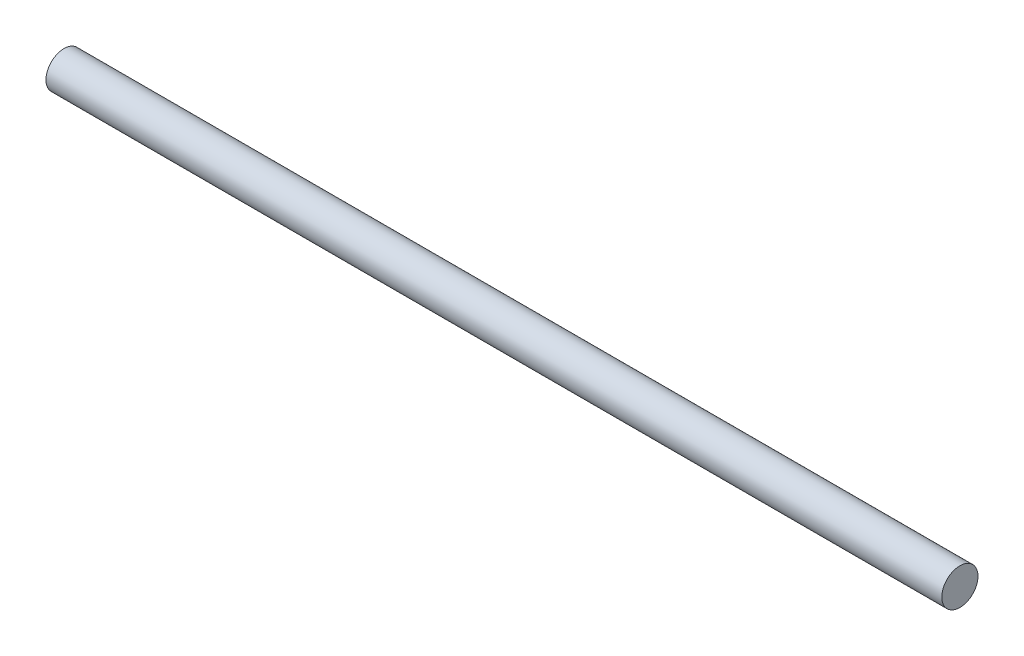
ISO-10303-21;
HEADER;
FILE_DESCRIPTION(('STEP AP214'),'2;1');
FILE_NAME('part.step','',(''),(''),'','','');
FILE_SCHEMA(('AUTOMOTIVE_DESIGN { 1 0 10303 214 1 1 1 1 }'));
ENDSEC;
DATA;
#1=APPLICATION_CONTEXT('core data for automotive mechanical design processes');
#2=APPLICATION_PROTOCOL_DEFINITION('international standard','automotive_design',2000,#1);
#3=PRODUCT_CONTEXT('',#1,'mechanical');
#4=PRODUCT('Part','Part','',(#3));
#5=PRODUCT_RELATED_PRODUCT_CATEGORY('part','',(#4));
#6=PRODUCT_DEFINITION_FORMATION('','',#4);
#7=PRODUCT_DEFINITION_CONTEXT('part definition',#1,'design');
#8=PRODUCT_DEFINITION('design','',#6,#7);
#9=PRODUCT_DEFINITION_SHAPE('','',#8);
#10=(LENGTH_UNIT() NAMED_UNIT(*) SI_UNIT(.MILLI.,.METRE.));
#11=(NAMED_UNIT(*) PLANE_ANGLE_UNIT() SI_UNIT($,.RADIAN.));
#12=(NAMED_UNIT(*) SI_UNIT($,.STERADIAN.) SOLID_ANGLE_UNIT());
#13=UNCERTAINTY_MEASURE_WITH_UNIT(LENGTH_MEASURE(1.E-05),#10,'distance_accuracy_value','');
#14=(GEOMETRIC_REPRESENTATION_CONTEXT(3) GLOBAL_UNCERTAINTY_ASSIGNED_CONTEXT((#13)) GLOBAL_UNIT_ASSIGNED_CONTEXT((#10,
#11,#12)) REPRESENTATION_CONTEXT('',''));
#15=CARTESIAN_POINT('',(0.,0.,0.));
#16=DIRECTION('',(0.,0.,1.));
#17=DIRECTION('',(1.,0.,0.));
#18=AXIS2_PLACEMENT_3D('',#15,#16,#17);
#19=CARTESIAN_POINT('',(314.325,0.,0.));
#20=DIRECTION('',(-1.,0.,0.));
#21=DIRECTION('',(0.,0.,1.));
#22=AXIS2_PLACEMENT_3D('',#19,#20,#21);
#23=CYLINDRICAL_SURFACE('',#22,6.35);
#24=CARTESIAN_POINT('',(314.325,0.,0.));
#25=DIRECTION('',(1.,0.,0.));
#26=DIRECTION('',(0.,0.,-1.));
#27=AXIS2_PLACEMENT_3D('',#24,#25,#26);
#28=CIRCLE('',#27,6.35);
#29=CARTESIAN_POINT('',(314.325,0.,-6.35));
#30=VERTEX_POINT('',#29);
#31=EDGE_CURVE('E10',#30,#30,#28,.T.);
#32=ORIENTED_EDGE('',*,*,#31,.F.);
#33=EDGE_LOOP('',(#32));
#34=FACE_BOUND('',#33,.T.);
#35=CARTESIAN_POINT('',(0.,0.,0.));
#36=DIRECTION('',(1.,0.,0.));
#37=DIRECTION('',(0.,0.,-1.));
#38=AXIS2_PLACEMENT_3D('',#35,#36,#37);
#39=CIRCLE('',#38,6.35);
#40=CARTESIAN_POINT('',(0.,0.,-6.35));
#41=VERTEX_POINT('',#40);
#42=EDGE_CURVE('E34',#41,#41,#39,.T.);
#43=ORIENTED_EDGE('',*,*,#42,.T.);
#44=EDGE_LOOP('',(#43));
#45=FACE_BOUND('',#44,.T.);
#46=ADVANCED_FACE('F31',(#34,#45),#23,.T.);
#47=CARTESIAN_POINT('',(314.325,0.,0.));
#48=DIRECTION('',(1.,0.,0.));
#49=DIRECTION('',(0.,0.,-1.));
#50=AXIS2_PLACEMENT_3D('',#47,#48,#49);
#51=PLANE('',#50);
#52=ORIENTED_EDGE('',*,*,#31,.T.);
#53=EDGE_LOOP('',(#52));
#54=FACE_BOUND('',#53,.T.);
#55=ADVANCED_FACE('F46',(#54),#51,.T.);
#56=CARTESIAN_POINT('',(0.,0.,0.));
#57=DIRECTION('',(1.,0.,0.));
#58=DIRECTION('',(0.,0.,-1.));
#59=AXIS2_PLACEMENT_3D('',#56,#57,#58);
#60=PLANE('',#59);
#61=ORIENTED_EDGE('',*,*,#42,.F.);
#62=EDGE_LOOP('',(#61));
#63=FACE_BOUND('',#62,.T.);
#64=ADVANCED_FACE('F44',(#63),#60,.F.);
#65=CLOSED_SHELL('',(#46,#55,#64));
#66=MANIFOLD_SOLID_BREP('B2',#65);
#67=ADVANCED_BREP_SHAPE_REPRESENTATION('',(#18,#66),#14);
#68=SHAPE_DEFINITION_REPRESENTATION(#9,#67);
ENDSEC;
END-ISO-10303-21;
